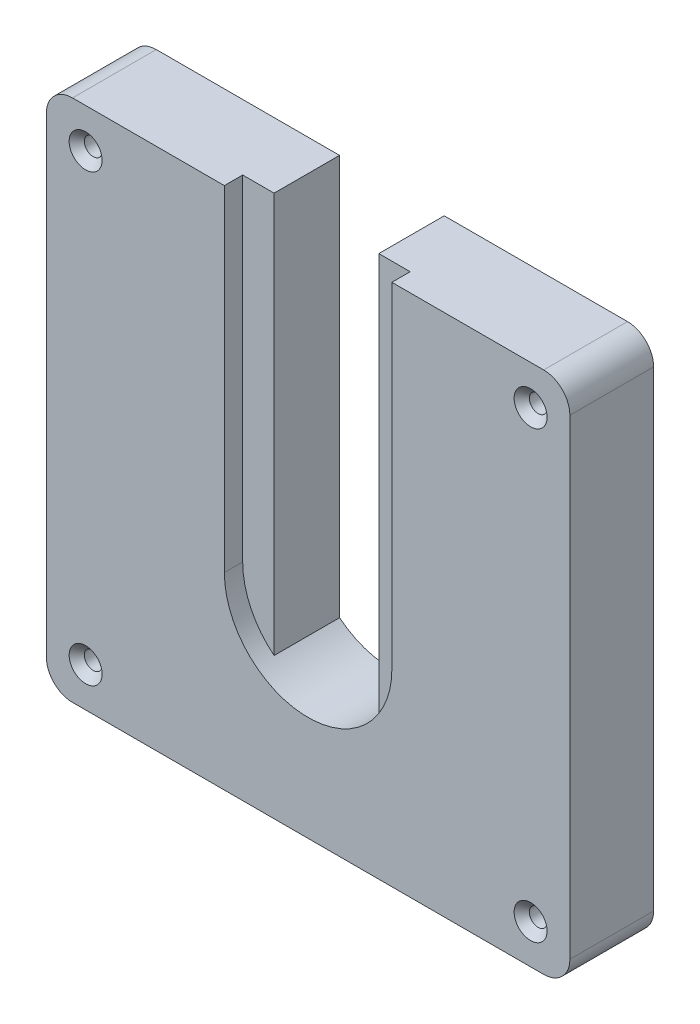
ISO-10303-21;
HEADER;
FILE_DESCRIPTION(('STEP AP214'),'2;1');
FILE_NAME('part.step','',(''),(''),'','','');
FILE_SCHEMA(('AUTOMOTIVE_DESIGN { 1 0 10303 214 1 1 1 1 }'));
ENDSEC;
DATA;
#1=APPLICATION_CONTEXT('core data for automotive mechanical design processes');
#2=APPLICATION_PROTOCOL_DEFINITION('international standard','automotive_design',2000,#1);
#3=PRODUCT_CONTEXT('',#1,'mechanical');
#4=PRODUCT('Part','Part','',(#3));
#5=PRODUCT_RELATED_PRODUCT_CATEGORY('part','',(#4));
#6=PRODUCT_DEFINITION_FORMATION('','',#4);
#7=PRODUCT_DEFINITION_CONTEXT('part definition',#1,'design');
#8=PRODUCT_DEFINITION('design','',#6,#7);
#9=PRODUCT_DEFINITION_SHAPE('','',#8);
#10=(LENGTH_UNIT() NAMED_UNIT(*) SI_UNIT(.MILLI.,.METRE.));
#11=(NAMED_UNIT(*) PLANE_ANGLE_UNIT() SI_UNIT($,.RADIAN.));
#12=(NAMED_UNIT(*) SI_UNIT($,.STERADIAN.) SOLID_ANGLE_UNIT());
#13=UNCERTAINTY_MEASURE_WITH_UNIT(LENGTH_MEASURE(1.E-05),#10,'distance_accuracy_value','');
#14=(GEOMETRIC_REPRESENTATION_CONTEXT(3) GLOBAL_UNCERTAINTY_ASSIGNED_CONTEXT((#13)) GLOBAL_UNIT_ASSIGNED_CONTEXT((#10,
#11,#12)) REPRESENTATION_CONTEXT('',''));
#15=CARTESIAN_POINT('',(0.,0.,0.));
#16=DIRECTION('',(0.,0.,1.));
#17=DIRECTION('',(1.,0.,0.));
#18=AXIS2_PLACEMENT_3D('',#15,#16,#17);
#19=CARTESIAN_POINT('',(10.,-30.,28.5));
#20=DIRECTION('',(1.,0.,0.));
#21=DIRECTION('',(0.,0.,-1.));
#22=AXIS2_PLACEMENT_3D('',#19,#20,#21);
#23=PLANE('',#22);
#24=DIRECTION('',(0.,0.,1.));
#25=VECTOR('',#24,1.);
#26=CARTESIAN_POINT('',(10.,-26.4899959967968,16.));
#27=LINE('',#26,#25);
#28=CARTESIAN_POINT('',(10.,-26.4899959967968,28.5));
#29=VERTEX_POINT('',#28);
#30=CARTESIAN_POINT('',(10.,-26.4899959967968,16.));
#31=VERTEX_POINT('',#30);
#32=EDGE_CURVE('E220',#29,#31,#27,.F.);
#33=ORIENTED_EDGE('',*,*,#32,.F.);
#34=DIRECTION('',(0.,1.,0.));
#35=VECTOR('',#34,1.);
#36=CARTESIAN_POINT('',(10.,-30.,28.5));
#37=LINE('',#36,#35);
#38=CARTESIAN_POINT('',(10.,50.,28.5));
#39=VERTEX_POINT('',#38);
#40=EDGE_CURVE('E271',#29,#39,#37,.T.);
#41=ORIENTED_EDGE('',*,*,#40,.T.);
#42=DIRECTION('',(0.,0.,-1.));
#43=VECTOR('',#42,1.);
#44=CARTESIAN_POINT('',(10.,50.,28.5));
#45=LINE('',#44,#43);
#46=CARTESIAN_POINT('',(10.,50.,16.));
#47=VERTEX_POINT('',#46);
#48=EDGE_CURVE('E244',#39,#47,#45,.T.);
#49=ORIENTED_EDGE('',*,*,#48,.T.);
#50=DIRECTION('',(0.,1.,0.));
#51=VECTOR('',#50,1.);
#52=CARTESIAN_POINT('',(10.,-30.,16.));
#53=LINE('',#52,#51);
#54=EDGE_CURVE('E205',#31,#47,#53,.T.);
#55=ORIENTED_EDGE('',*,*,#54,.F.);
#56=EDGE_LOOP('',(#33,#41,#49,#55));
#57=FACE_BOUND('',#56,.T.);
#58=ADVANCED_FACE('F76',(#57),#23,.F.);
#59=CARTESIAN_POINT('',(16.,-30.,28.5));
#60=DIRECTION('',(0.,0.,-1.));
#61=DIRECTION('',(-1.,0.,0.));
#62=AXIS2_PLACEMENT_3D('',#59,#60,#61);
#63=PLANE('',#62);
#64=CARTESIAN_POINT('',(0.,-14.,28.5));
#65=DIRECTION('',(0.,0.,-1.));
#66=DIRECTION('',(-1.,0.,0.));
#67=AXIS2_PLACEMENT_3D('',#64,#65,#66);
#68=CIRCLE('',#67,16.);
#69=CARTESIAN_POINT('',(16.,-14.,28.5));
#70=VERTEX_POINT('',#69);
#71=EDGE_CURVE('E315',#70,#29,#68,.T.);
#72=ORIENTED_EDGE('',*,*,#71,.F.);
#73=DIRECTION('',(0.,1.,0.));
#74=VECTOR('',#73,1.);
#75=CARTESIAN_POINT('',(16.,-30.,28.5));
#76=LINE('',#75,#74);
#77=CARTESIAN_POINT('',(16.,50.,28.5));
#78=VERTEX_POINT('',#77);
#79=EDGE_CURVE('E274',#70,#78,#76,.T.);
#80=ORIENTED_EDGE('',*,*,#79,.T.);
#81=DIRECTION('',(-1.,0.,0.));
#82=VECTOR('',#81,1.);
#83=CARTESIAN_POINT('',(16.,50.,28.5));
#84=LINE('',#83,#82);
#85=EDGE_CURVE('E240',#78,#39,#84,.T.);
#86=ORIENTED_EDGE('',*,*,#85,.T.);
#87=ORIENTED_EDGE('',*,*,#40,.F.);
#88=EDGE_LOOP('',(#72,#80,#86,#87));
#89=FACE_BOUND('',#88,.T.);
#90=ADVANCED_FACE('F390',(#89),#63,.F.);
#91=CARTESIAN_POINT('',(-16.,-30.,32.));
#92=DIRECTION('',(-1.,0.,0.));
#93=DIRECTION('',(0.,0.,1.));
#94=AXIS2_PLACEMENT_3D('',#91,#92,#93);
#95=PLANE('',#94);
#96=DIRECTION('',(0.,0.,1.));
#97=VECTOR('',#96,1.);
#98=CARTESIAN_POINT('',(-16.,-14.,16.));
#99=LINE('',#98,#97);
#100=CARTESIAN_POINT('',(-16.,-14.,28.5));
#101=VERTEX_POINT('',#100);
#102=CARTESIAN_POINT('',(-16.,-14.,32.));
#103=VERTEX_POINT('',#102);
#104=EDGE_CURVE('E222',#101,#103,#99,.T.);
#105=ORIENTED_EDGE('',*,*,#104,.F.);
#106=DIRECTION('',(0.,1.,0.));
#107=VECTOR('',#106,1.);
#108=CARTESIAN_POINT('',(-16.,-30.,28.5));
#109=LINE('',#108,#107);
#110=CARTESIAN_POINT('',(-16.,50.,28.5));
#111=VERTEX_POINT('',#110);
#112=EDGE_CURVE('E264',#101,#111,#109,.T.);
#113=ORIENTED_EDGE('',*,*,#112,.T.);
#114=DIRECTION('',(0.,0.,1.));
#115=VECTOR('',#114,1.);
#116=CARTESIAN_POINT('',(-16.,50.,32.));
#117=LINE('',#116,#115);
#118=CARTESIAN_POINT('',(-16.,50.,32.));
#119=VERTEX_POINT('',#118);
#120=EDGE_CURVE('E255',#111,#119,#117,.T.);
#121=ORIENTED_EDGE('',*,*,#120,.T.);
#122=DIRECTION('',(0.,1.,0.));
#123=VECTOR('',#122,1.);
#124=CARTESIAN_POINT('',(-16.,-30.,32.));
#125=LINE('',#124,#123);
#126=EDGE_CURVE('E260',#103,#119,#125,.T.);
#127=ORIENTED_EDGE('',*,*,#126,.F.);
#128=EDGE_LOOP('',(#105,#113,#121,#127));
#129=FACE_BOUND('',#128,.T.);
#130=ADVANCED_FACE('F401',(#129),#95,.F.);
#131=CARTESIAN_POINT('',(-16.,-30.,28.5));
#132=DIRECTION('',(0.,0.,-1.));
#133=DIRECTION('',(-1.,0.,0.));
#134=AXIS2_PLACEMENT_3D('',#131,#132,#133);
#135=PLANE('',#134);
#136=CARTESIAN_POINT('',(0.,-14.,28.5));
#137=DIRECTION('',(0.,0.,-1.));
#138=DIRECTION('',(-1.,0.,0.));
#139=AXIS2_PLACEMENT_3D('',#136,#137,#138);
#140=CIRCLE('',#139,16.);
#141=CARTESIAN_POINT('',(-10.,-26.4899959967968,28.5));
#142=VERTEX_POINT('',#141);
#143=EDGE_CURVE('E228',#142,#101,#140,.T.);
#144=ORIENTED_EDGE('',*,*,#143,.F.);
#145=DIRECTION('',(0.,1.,0.));
#146=VECTOR('',#145,1.);
#147=CARTESIAN_POINT('',(-10.,-30.,28.5));
#148=LINE('',#147,#146);
#149=CARTESIAN_POINT('',(-10.,50.,28.5));
#150=VERTEX_POINT('',#149);
#151=EDGE_CURVE('E204',#142,#150,#148,.T.);
#152=ORIENTED_EDGE('',*,*,#151,.T.);
#153=DIRECTION('',(-1.,0.,0.));
#154=VECTOR('',#153,1.);
#155=CARTESIAN_POINT('',(-16.,50.,28.5));
#156=LINE('',#155,#154);
#157=EDGE_CURVE('E251',#150,#111,#156,.T.);
#158=ORIENTED_EDGE('',*,*,#157,.T.);
#159=ORIENTED_EDGE('',*,*,#112,.F.);
#160=EDGE_LOOP('',(#144,#152,#158,#159));
#161=FACE_BOUND('',#160,.T.);
#162=ADVANCED_FACE('F403',(#161),#135,.F.);
#163=CARTESIAN_POINT('',(-10.,-30.,28.5));
#164=DIRECTION('',(-1.,0.,0.));
#165=DIRECTION('',(0.,0.,1.));
#166=AXIS2_PLACEMENT_3D('',#163,#164,#165);
#167=PLANE('',#166);
#168=DIRECTION('',(0.,0.,1.));
#169=VECTOR('',#168,1.);
#170=CARTESIAN_POINT('',(-10.,-26.4899959967968,16.));
#171=LINE('',#170,#169);
#172=CARTESIAN_POINT('',(-10.,-26.4899959967968,16.));
#173=VERTEX_POINT('',#172);
#174=EDGE_CURVE('E209',#173,#142,#171,.T.);
#175=ORIENTED_EDGE('',*,*,#174,.F.);
#176=DIRECTION('',(0.,1.,0.));
#177=VECTOR('',#176,1.);
#178=CARTESIAN_POINT('',(-10.,-30.,16.));
#179=LINE('',#178,#177);
#180=CARTESIAN_POINT('',(-10.,50.,16.));
#181=VERTEX_POINT('',#180);
#182=EDGE_CURVE('E190',#173,#181,#179,.T.);
#183=ORIENTED_EDGE('',*,*,#182,.T.);
#184=DIRECTION('',(0.,0.,1.));
#185=VECTOR('',#184,1.);
#186=CARTESIAN_POINT('',(-10.,50.,28.5));
#187=LINE('',#186,#185);
#188=EDGE_CURVE('E248',#181,#150,#187,.T.);
#189=ORIENTED_EDGE('',*,*,#188,.T.);
#190=ORIENTED_EDGE('',*,*,#151,.F.);
#191=EDGE_LOOP('',(#175,#183,#189,#190));
#192=FACE_BOUND('',#191,.T.);
#193=ADVANCED_FACE('F210',(#192),#167,.F.);
#194=CARTESIAN_POINT('',(50.,50.,32.));
#195=DIRECTION('',(0.,-1.,0.));
#196=DIRECTION('',(0.,0.,-1.));
#197=AXIS2_PLACEMENT_3D('',#194,#195,#196);
#198=PLANE('',#197);
#199=DIRECTION('',(-1.,0.,0.));
#200=VECTOR('',#199,1.);
#201=CARTESIAN_POINT('',(50.,50.,16.));
#202=LINE('',#201,#200);
#203=CARTESIAN_POINT('',(-45.,50.,16.));
#204=VERTEX_POINT('',#203);
#205=EDGE_CURVE('E199',#181,#204,#202,.T.);
#206=ORIENTED_EDGE('',*,*,#205,.T.);
#207=DIRECTION('',(0.,0.,-1.));
#208=VECTOR('',#207,1.);
#209=CARTESIAN_POINT('',(-45.,50.,32.));
#210=LINE('',#209,#208);
#211=CARTESIAN_POINT('',(-45.,50.,32.));
#212=VERTEX_POINT('',#211);
#213=EDGE_CURVE('E12',#204,#212,#210,.F.);
#214=ORIENTED_EDGE('',*,*,#213,.T.);
#215=DIRECTION('',(-1.,0.,0.));
#216=VECTOR('',#215,1.);
#217=CARTESIAN_POINT('',(50.,50.,32.));
#218=LINE('',#217,#216);
#219=EDGE_CURVE('E292',#119,#212,#218,.T.);
#220=ORIENTED_EDGE('',*,*,#219,.F.);
#221=ORIENTED_EDGE('',*,*,#120,.F.);
#222=ORIENTED_EDGE('',*,*,#157,.F.);
#223=ORIENTED_EDGE('',*,*,#188,.F.);
#224=EDGE_LOOP('',(#206,#214,#220,#221,#222,#223));
#225=FACE_BOUND('',#224,.T.);
#226=ADVANCED_FACE('F408',(#225),#198,.F.);
#227=CARTESIAN_POINT('',(-50.,50.,32.));
#228=DIRECTION('',(1.,0.,0.));
#229=DIRECTION('',(0.,0.,-1.));
#230=AXIS2_PLACEMENT_3D('',#227,#228,#229);
#231=PLANE('',#230);
#232=DIRECTION('',(0.,-1.,0.));
#233=VECTOR('',#232,1.);
#234=CARTESIAN_POINT('',(-50.,50.,16.));
#235=LINE('',#234,#233);
#236=CARTESIAN_POINT('',(-50.,45.,16.));
#237=VERTEX_POINT('',#236);
#238=CARTESIAN_POINT('',(-50.,-45.,16.));
#239=VERTEX_POINT('',#238);
#240=EDGE_CURVE('E263',#237,#239,#235,.T.);
#241=ORIENTED_EDGE('',*,*,#240,.T.);
#242=DIRECTION('',(0.,0.,-1.));
#243=VECTOR('',#242,1.);
#244=CARTESIAN_POINT('',(-50.,-45.,32.));
#245=LINE('',#244,#243);
#246=CARTESIAN_POINT('',(-50.,-45.,32.));
#247=VERTEX_POINT('',#246);
#248=EDGE_CURVE('E357',#239,#247,#245,.F.);
#249=ORIENTED_EDGE('',*,*,#248,.T.);
#250=DIRECTION('',(0.,-1.,0.));
#251=VECTOR('',#250,1.);
#252=CARTESIAN_POINT('',(-50.,50.,32.));
#253=LINE('',#252,#251);
#254=CARTESIAN_POINT('',(-50.,45.,32.));
#255=VERTEX_POINT('',#254);
#256=EDGE_CURVE('E280',#255,#247,#253,.T.);
#257=ORIENTED_EDGE('',*,*,#256,.F.);
#258=DIRECTION('',(0.,0.,-1.));
#259=VECTOR('',#258,1.);
#260=CARTESIAN_POINT('',(-50.,45.,32.));
#261=LINE('',#260,#259);
#262=EDGE_CURVE('E353',#255,#237,#261,.T.);
#263=ORIENTED_EDGE('',*,*,#262,.T.);
#264=EDGE_LOOP('',(#241,#249,#257,#263));
#265=FACE_BOUND('',#264,.T.);
#266=ADVANCED_FACE('F418',(#265),#231,.F.);
#267=CARTESIAN_POINT('',(-50.,-50.,32.));
#268=DIRECTION('',(0.,1.,0.));
#269=DIRECTION('',(0.,0.,1.));
#270=AXIS2_PLACEMENT_3D('',#267,#268,#269);
#271=PLANE('',#270);
#272=DIRECTION('',(1.,0.,0.));
#273=VECTOR('',#272,1.);
#274=CARTESIAN_POINT('',(-50.,-50.,32.));
#275=LINE('',#274,#273);
#276=CARTESIAN_POINT('',(-45.,-50.,32.));
#277=VERTEX_POINT('',#276);
#278=CARTESIAN_POINT('',(45.,-50.,32.));
#279=VERTEX_POINT('',#278);
#280=EDGE_CURVE('E284',#277,#279,#275,.T.);
#281=ORIENTED_EDGE('',*,*,#280,.F.);
#282=DIRECTION('',(0.,0.,-1.));
#283=VECTOR('',#282,1.);
#284=CARTESIAN_POINT('',(-45.,-50.,32.));
#285=LINE('',#284,#283);
#286=CARTESIAN_POINT('',(-45.,-50.,16.));
#287=VERTEX_POINT('',#286);
#288=EDGE_CURVE('E337',#277,#287,#285,.T.);
#289=ORIENTED_EDGE('',*,*,#288,.T.);
#290=DIRECTION('',(1.,0.,0.));
#291=VECTOR('',#290,1.);
#292=CARTESIAN_POINT('',(-50.,-50.,16.));
#293=LINE('',#292,#291);
#294=CARTESIAN_POINT('',(45.,-50.,16.));
#295=VERTEX_POINT('',#294);
#296=EDGE_CURVE('E298',#287,#295,#293,.T.);
#297=ORIENTED_EDGE('',*,*,#296,.T.);
#298=DIRECTION('',(0.,0.,-1.));
#299=VECTOR('',#298,1.);
#300=CARTESIAN_POINT('',(45.,-50.,32.));
#301=LINE('',#300,#299);
#302=EDGE_CURVE('E310',#295,#279,#301,.F.);
#303=ORIENTED_EDGE('',*,*,#302,.T.);
#304=EDGE_LOOP('',(#281,#289,#297,#303));
#305=FACE_BOUND('',#304,.T.);
#306=ADVANCED_FACE('F427',(#305),#271,.F.);
#307=CARTESIAN_POINT('',(50.,-50.,32.));
#308=DIRECTION('',(-1.,0.,0.));
#309=DIRECTION('',(0.,0.,1.));
#310=AXIS2_PLACEMENT_3D('',#307,#308,#309);
#311=PLANE('',#310);
#312=DIRECTION('',(0.,1.,0.));
#313=VECTOR('',#312,1.);
#314=CARTESIAN_POINT('',(50.,-50.,32.));
#315=LINE('',#314,#313);
#316=CARTESIAN_POINT('',(50.,-45.,32.));
#317=VERTEX_POINT('',#316);
#318=CARTESIAN_POINT('',(50.,45.,32.));
#319=VERTEX_POINT('',#318);
#320=EDGE_CURVE('E289',#317,#319,#315,.T.);
#321=ORIENTED_EDGE('',*,*,#320,.F.);
#322=DIRECTION('',(0.,0.,-1.));
#323=VECTOR('',#322,1.);
#324=CARTESIAN_POINT('',(50.,-45.,32.));
#325=LINE('',#324,#323);
#326=CARTESIAN_POINT('',(50.,-45.,16.));
#327=VERTEX_POINT('',#326);
#328=EDGE_CURVE('E373',#317,#327,#325,.T.);
#329=ORIENTED_EDGE('',*,*,#328,.T.);
#330=DIRECTION('',(0.,1.,0.));
#331=VECTOR('',#330,1.);
#332=CARTESIAN_POINT('',(50.,-50.,16.));
#333=LINE('',#332,#331);
#334=CARTESIAN_POINT('',(50.,45.,16.));
#335=VERTEX_POINT('',#334);
#336=EDGE_CURVE('E302',#327,#335,#333,.T.);
#337=ORIENTED_EDGE('',*,*,#336,.T.);
#338=DIRECTION('',(0.,0.,-1.));
#339=VECTOR('',#338,1.);
#340=CARTESIAN_POINT('',(50.,45.,32.));
#341=LINE('',#340,#339);
#342=EDGE_CURVE('E100',#335,#319,#341,.F.);
#343=ORIENTED_EDGE('',*,*,#342,.T.);
#344=EDGE_LOOP('',(#321,#329,#337,#343));
#345=FACE_BOUND('',#344,.T.);
#346=ADVANCED_FACE('F432',(#345),#311,.F.);
#347=CARTESIAN_POINT('',(45.,50.,32.));
#348=VERTEX_POINT('',#347);
#349=CARTESIAN_POINT('',(16.,50.,32.));
#350=VERTEX_POINT('',#349);
#351=EDGE_CURVE('E215',#348,#350,#218,.T.);
#352=ORIENTED_EDGE('',*,*,#351,.F.);
#353=DIRECTION('',(0.,0.,-1.));
#354=VECTOR('',#353,1.);
#355=CARTESIAN_POINT('',(45.,50.,32.));
#356=LINE('',#355,#354);
#357=CARTESIAN_POINT('',(45.,50.,16.));
#358=VERTEX_POINT('',#357);
#359=EDGE_CURVE('E85',#348,#358,#356,.T.);
#360=ORIENTED_EDGE('',*,*,#359,.T.);
#361=EDGE_CURVE('E285',#358,#47,#202,.T.);
#362=ORIENTED_EDGE('',*,*,#361,.T.);
#363=ORIENTED_EDGE('',*,*,#48,.F.);
#364=ORIENTED_EDGE('',*,*,#85,.F.);
#365=DIRECTION('',(0.,0.,-1.));
#366=VECTOR('',#365,1.);
#367=CARTESIAN_POINT('',(16.,50.,32.));
#368=LINE('',#367,#366);
#369=EDGE_CURVE('E236',#350,#78,#368,.T.);
#370=ORIENTED_EDGE('',*,*,#369,.F.);
#371=EDGE_LOOP('',(#352,#360,#362,#363,#364,#370));
#372=FACE_BOUND('',#371,.T.);
#373=ADVANCED_FACE('F381',(#372),#198,.F.);
#374=CARTESIAN_POINT('',(0.,0.,32.));
#375=DIRECTION('',(0.,0.,1.));
#376=DIRECTION('',(1.,0.,0.));
#377=AXIS2_PLACEMENT_3D('',#374,#375,#376);
#378=PLANE('',#377);
#379=CARTESIAN_POINT('',(-42.5,42.5,32.));
#380=DIRECTION('',(0.,0.,1.));
#381=DIRECTION('',(1.,0.,0.));
#382=AXIS2_PLACEMENT_3D('',#379,#380,#381);
#383=CIRCLE('',#382,3.15);
#384=CARTESIAN_POINT('',(-39.35,42.5,32.));
#385=VERTEX_POINT('',#384);
#386=EDGE_CURVE('E702',#385,#385,#383,.T.);
#387=ORIENTED_EDGE('',*,*,#386,.F.);
#388=EDGE_LOOP('',(#387));
#389=FACE_BOUND('',#388,.T.);
#390=CARTESIAN_POINT('',(42.5,42.5,32.));
#391=DIRECTION('',(0.,0.,1.));
#392=DIRECTION('',(1.,0.,0.));
#393=AXIS2_PLACEMENT_3D('',#390,#391,#392);
#394=CIRCLE('',#393,3.15);
#395=CARTESIAN_POINT('',(45.65,42.5,32.));
#396=VERTEX_POINT('',#395);
#397=EDGE_CURVE('E333',#396,#396,#394,.T.);
#398=ORIENTED_EDGE('',*,*,#397,.F.);
#399=EDGE_LOOP('',(#398));
#400=FACE_BOUND('',#399,.T.);
#401=CARTESIAN_POINT('',(42.5,-42.5,32.));
#402=DIRECTION('',(0.,0.,1.));
#403=DIRECTION('',(1.,0.,0.));
#404=AXIS2_PLACEMENT_3D('',#401,#402,#403);
#405=CIRCLE('',#404,3.15);
#406=CARTESIAN_POINT('',(45.65,-42.5,32.));
#407=VERTEX_POINT('',#406);
#408=EDGE_CURVE('E327',#407,#407,#405,.T.);
#409=ORIENTED_EDGE('',*,*,#408,.F.);
#410=EDGE_LOOP('',(#409));
#411=FACE_BOUND('',#410,.T.);
#412=CARTESIAN_POINT('',(-42.5,-42.5,32.));
#413=DIRECTION('',(0.,0.,1.));
#414=DIRECTION('',(1.,0.,0.));
#415=AXIS2_PLACEMENT_3D('',#412,#413,#414);
#416=CIRCLE('',#415,3.15);
#417=CARTESIAN_POINT('',(-39.35,-42.5,32.));
#418=VERTEX_POINT('',#417);
#419=EDGE_CURVE('E321',#418,#418,#416,.T.);
#420=ORIENTED_EDGE('',*,*,#419,.F.);
#421=EDGE_LOOP('',(#420));
#422=FACE_BOUND('',#421,.T.);
#423=ORIENTED_EDGE('',*,*,#256,.T.);
#424=CARTESIAN_POINT('',(-45.,-45.,32.));
#425=DIRECTION('',(0.,0.,1.));
#426=DIRECTION('',(1.,0.,0.));
#427=AXIS2_PLACEMENT_3D('',#424,#425,#426);
#428=CIRCLE('',#427,5.);
#429=EDGE_CURVE('E368',#247,#277,#428,.T.);
#430=ORIENTED_EDGE('',*,*,#429,.T.);
#431=ORIENTED_EDGE('',*,*,#280,.T.);
#432=CARTESIAN_POINT('',(45.,-45.,32.));
#433=DIRECTION('',(0.,0.,1.));
#434=DIRECTION('',(1.,0.,0.));
#435=AXIS2_PLACEMENT_3D('',#432,#433,#434);
#436=CIRCLE('',#435,5.);
#437=EDGE_CURVE('E365',#279,#317,#436,.T.);
#438=ORIENTED_EDGE('',*,*,#437,.T.);
#439=ORIENTED_EDGE('',*,*,#320,.T.);
#440=CARTESIAN_POINT('',(45.,45.,32.));
#441=DIRECTION('',(0.,0.,1.));
#442=DIRECTION('',(1.,0.,0.));
#443=AXIS2_PLACEMENT_3D('',#440,#441,#442);
#444=CIRCLE('',#443,5.);
#445=EDGE_CURVE('E92',#319,#348,#444,.T.);
#446=ORIENTED_EDGE('',*,*,#445,.T.);
#447=ORIENTED_EDGE('',*,*,#351,.T.);
#448=DIRECTION('',(0.,1.,0.));
#449=VECTOR('',#448,1.);
#450=CARTESIAN_POINT('',(16.,-30.,32.));
#451=LINE('',#450,#449);
#452=CARTESIAN_POINT('',(16.,-14.,32.));
#453=VERTEX_POINT('',#452);
#454=EDGE_CURVE('E259',#453,#350,#451,.T.);
#455=ORIENTED_EDGE('',*,*,#454,.F.);
#456=CARTESIAN_POINT('',(0.,-14.,32.));
#457=DIRECTION('',(0.,0.,1.));
#458=DIRECTION('',(1.,0.,0.));
#459=AXIS2_PLACEMENT_3D('',#456,#457,#458);
#460=CIRCLE('',#459,16.);
#461=EDGE_CURVE('E223',#103,#453,#460,.T.);
#462=ORIENTED_EDGE('',*,*,#461,.F.);
#463=ORIENTED_EDGE('',*,*,#126,.T.);
#464=ORIENTED_EDGE('',*,*,#219,.T.);
#465=CARTESIAN_POINT('',(-45.,45.,32.));
#466=DIRECTION('',(0.,0.,1.));
#467=DIRECTION('',(1.,0.,0.));
#468=AXIS2_PLACEMENT_3D('',#465,#466,#467);
#469=CIRCLE('',#468,5.);
#470=EDGE_CURVE('E360',#212,#255,#469,.T.);
#471=ORIENTED_EDGE('',*,*,#470,.T.);
#472=EDGE_LOOP('',(#423,#430,#431,#438,#439,#446,#447,#455,#462,#463,#464,#471));
#473=FACE_BOUND('',#472,.T.);
#474=ADVANCED_FACE('F397',(#389,#400,#411,#422,#473),#378,.T.);
#475=CARTESIAN_POINT('',(0.,0.,16.));
#476=DIRECTION('',(0.,0.,1.));
#477=DIRECTION('',(1.,0.,0.));
#478=AXIS2_PLACEMENT_3D('',#475,#476,#477);
#479=PLANE('',#478);
#480=CARTESIAN_POINT('',(-42.5,42.5,16.));
#481=DIRECTION('',(0.,0.,1.));
#482=DIRECTION('',(1.,0.,0.));
#483=AXIS2_PLACEMENT_3D('',#480,#481,#482);
#484=CIRCLE('',#483,1.69999999999999);
#485=CARTESIAN_POINT('',(-40.8,42.5,16.));
#486=VERTEX_POINT('',#485);
#487=EDGE_CURVE('E329',#486,#486,#484,.T.);
#488=ORIENTED_EDGE('',*,*,#487,.T.);
#489=EDGE_LOOP('',(#488));
#490=FACE_BOUND('',#489,.T.);
#491=CARTESIAN_POINT('',(42.5,42.5,16.));
#492=DIRECTION('',(0.,0.,1.));
#493=DIRECTION('',(1.,0.,0.));
#494=AXIS2_PLACEMENT_3D('',#491,#492,#493);
#495=CIRCLE('',#494,1.69999999999999);
#496=CARTESIAN_POINT('',(44.2,42.5,16.));
#497=VERTEX_POINT('',#496);
#498=EDGE_CURVE('E323',#497,#497,#495,.T.);
#499=ORIENTED_EDGE('',*,*,#498,.T.);
#500=EDGE_LOOP('',(#499));
#501=FACE_BOUND('',#500,.T.);
#502=CARTESIAN_POINT('',(42.5,-42.5,16.));
#503=DIRECTION('',(0.,0.,1.));
#504=DIRECTION('',(1.,0.,0.));
#505=AXIS2_PLACEMENT_3D('',#502,#503,#504);
#506=CIRCLE('',#505,1.69999999999999);
#507=CARTESIAN_POINT('',(44.2,-42.5,16.));
#508=VERTEX_POINT('',#507);
#509=EDGE_CURVE('E317',#508,#508,#506,.T.);
#510=ORIENTED_EDGE('',*,*,#509,.T.);
#511=EDGE_LOOP('',(#510));
#512=FACE_BOUND('',#511,.T.);
#513=CARTESIAN_POINT('',(-42.5,-42.5,16.));
#514=DIRECTION('',(0.,0.,1.));
#515=DIRECTION('',(1.,0.,0.));
#516=AXIS2_PLACEMENT_3D('',#513,#514,#515);
#517=CIRCLE('',#516,1.69999999999999);
#518=CARTESIAN_POINT('',(-40.8,-42.5,16.));
#519=VERTEX_POINT('',#518);
#520=EDGE_CURVE('E311',#519,#519,#517,.T.);
#521=ORIENTED_EDGE('',*,*,#520,.T.);
#522=EDGE_LOOP('',(#521));
#523=FACE_BOUND('',#522,.T.);
#524=ORIENTED_EDGE('',*,*,#296,.F.);
#525=CARTESIAN_POINT('',(-45.,-45.,16.));
#526=DIRECTION('',(0.,0.,1.));
#527=DIRECTION('',(1.,0.,0.));
#528=AXIS2_PLACEMENT_3D('',#525,#526,#527);
#529=CIRCLE('',#528,5.);
#530=EDGE_CURVE('E350',#287,#239,#529,.F.);
#531=ORIENTED_EDGE('',*,*,#530,.T.);
#532=ORIENTED_EDGE('',*,*,#240,.F.);
#533=CARTESIAN_POINT('',(-45.,45.,16.));
#534=DIRECTION('',(0.,0.,1.));
#535=DIRECTION('',(1.,0.,0.));
#536=AXIS2_PLACEMENT_3D('',#533,#534,#535);
#537=CIRCLE('',#536,5.);
#538=EDGE_CURVE('E341',#237,#204,#537,.F.);
#539=ORIENTED_EDGE('',*,*,#538,.T.);
#540=ORIENTED_EDGE('',*,*,#205,.F.);
#541=ORIENTED_EDGE('',*,*,#182,.F.);
#542=CARTESIAN_POINT('',(0.,-14.,16.));
#543=DIRECTION('',(0.,0.,1.));
#544=DIRECTION('',(1.,0.,0.));
#545=AXIS2_PLACEMENT_3D('',#542,#543,#544);
#546=CIRCLE('',#545,16.);
#547=EDGE_CURVE('E196',#173,#31,#546,.T.);
#548=ORIENTED_EDGE('',*,*,#547,.T.);
#549=ORIENTED_EDGE('',*,*,#54,.T.);
#550=ORIENTED_EDGE('',*,*,#361,.F.);
#551=CARTESIAN_POINT('',(45.,45.,16.));
#552=DIRECTION('',(0.,0.,1.));
#553=DIRECTION('',(1.,0.,0.));
#554=AXIS2_PLACEMENT_3D('',#551,#552,#553);
#555=CIRCLE('',#554,5.);
#556=EDGE_CURVE('E344',#358,#335,#555,.F.);
#557=ORIENTED_EDGE('',*,*,#556,.T.);
#558=ORIENTED_EDGE('',*,*,#336,.F.);
#559=CARTESIAN_POINT('',(45.,-45.,16.));
#560=DIRECTION('',(0.,0.,1.));
#561=DIRECTION('',(1.,0.,0.));
#562=AXIS2_PLACEMENT_3D('',#559,#560,#561);
#563=CIRCLE('',#562,5.);
#564=EDGE_CURVE('E347',#327,#295,#563,.F.);
#565=ORIENTED_EDGE('',*,*,#564,.T.);
#566=EDGE_LOOP('',(#524,#531,#532,#539,#540,#541,#548,#549,#550,#557,#558,#565));
#567=FACE_BOUND('',#566,.T.);
#568=ADVANCED_FACE('F193',(#490,#501,#512,#523,#567),#479,.F.);
#569=CARTESIAN_POINT('',(16.,-30.,32.));
#570=DIRECTION('',(1.,0.,0.));
#571=DIRECTION('',(0.,0.,-1.));
#572=AXIS2_PLACEMENT_3D('',#569,#570,#571);
#573=PLANE('',#572);
#574=ORIENTED_EDGE('',*,*,#79,.F.);
#575=DIRECTION('',(0.,0.,1.));
#576=VECTOR('',#575,1.);
#577=CARTESIAN_POINT('',(16.,-14.,16.));
#578=LINE('',#577,#576);
#579=EDGE_CURVE('E214',#70,#453,#578,.T.);
#580=ORIENTED_EDGE('',*,*,#579,.T.);
#581=ORIENTED_EDGE('',*,*,#454,.T.);
#582=ORIENTED_EDGE('',*,*,#369,.T.);
#583=EDGE_LOOP('',(#574,#580,#581,#582));
#584=FACE_BOUND('',#583,.T.);
#585=ADVANCED_FACE('F394',(#584),#573,.F.);
#586=CARTESIAN_POINT('',(0.,-14.,16.));
#587=DIRECTION('',(0.,0.,1.));
#588=DIRECTION('',(1.,0.,0.));
#589=AXIS2_PLACEMENT_3D('',#586,#587,#588);
#590=CYLINDRICAL_SURFACE('',#589,16.);
#591=ORIENTED_EDGE('',*,*,#174,.T.);
#592=ORIENTED_EDGE('',*,*,#143,.T.);
#593=ORIENTED_EDGE('',*,*,#104,.T.);
#594=ORIENTED_EDGE('',*,*,#461,.T.);
#595=ORIENTED_EDGE('',*,*,#579,.F.);
#596=ORIENTED_EDGE('',*,*,#71,.T.);
#597=ORIENTED_EDGE('',*,*,#32,.T.);
#598=ORIENTED_EDGE('',*,*,#547,.F.);
#599=EDGE_LOOP('',(#591,#592,#593,#594,#595,#596,#597,#598));
#600=FACE_BOUND('',#599,.T.);
#601=ADVANCED_FACE('F218',(#600),#590,.F.);
#602=CARTESIAN_POINT('',(-42.5,-42.5,32.));
#603=DIRECTION('',(0.,0.,1.));
#604=DIRECTION('',(1.,0.,0.));
#605=AXIS2_PLACEMENT_3D('',#602,#603,#604);
#606=CYLINDRICAL_SURFACE('',#605,1.69999999999999);
#607=CARTESIAN_POINT('',(-42.5,-42.5,30.55));
#608=DIRECTION('',(0.,0.,1.));
#609=DIRECTION('',(1.,0.,0.));
#610=AXIS2_PLACEMENT_3D('',#607,#608,#609);
#611=CIRCLE('',#610,1.69999999999999);
#612=CARTESIAN_POINT('',(-40.8,-42.5,30.55));
#613=VERTEX_POINT('',#612);
#614=EDGE_CURVE('E316',#613,#613,#611,.T.);
#615=ORIENTED_EDGE('',*,*,#614,.T.);
#616=EDGE_LOOP('',(#615));
#617=FACE_BOUND('',#616,.T.);
#618=ORIENTED_EDGE('',*,*,#520,.F.);
#619=EDGE_LOOP('',(#618));
#620=FACE_BOUND('',#619,.T.);
#621=ADVANCED_FACE('F500',(#617,#620),#606,.F.);
#622=CARTESIAN_POINT('',(-42.5,-42.5,32.));
#623=DIRECTION('',(0.,0.,1.));
#624=DIRECTION('',(1.,0.,0.));
#625=AXIS2_PLACEMENT_3D('',#622,#623,#624);
#626=CONICAL_SURFACE('',#625,3.15,0.78539816339745);
#627=ORIENTED_EDGE('',*,*,#614,.F.);
#628=EDGE_LOOP('',(#627));
#629=FACE_BOUND('',#628,.T.);
#630=ORIENTED_EDGE('',*,*,#419,.T.);
#631=EDGE_LOOP('',(#630));
#632=FACE_BOUND('',#631,.T.);
#633=ADVANCED_FACE('F496',(#629,#632),#626,.F.);
#634=CARTESIAN_POINT('',(42.5,-42.5,32.));
#635=DIRECTION('',(0.,0.,1.));
#636=DIRECTION('',(1.,0.,0.));
#637=AXIS2_PLACEMENT_3D('',#634,#635,#636);
#638=CYLINDRICAL_SURFACE('',#637,1.69999999999999);
#639=CARTESIAN_POINT('',(42.5,-42.5,30.55));
#640=DIRECTION('',(0.,0.,1.));
#641=DIRECTION('',(1.,0.,0.));
#642=AXIS2_PLACEMENT_3D('',#639,#640,#641);
#643=CIRCLE('',#642,1.69999999999999);
#644=CARTESIAN_POINT('',(44.2,-42.5,30.55));
#645=VERTEX_POINT('',#644);
#646=EDGE_CURVE('E322',#645,#645,#643,.T.);
#647=ORIENTED_EDGE('',*,*,#646,.T.);
#648=EDGE_LOOP('',(#647));
#649=FACE_BOUND('',#648,.T.);
#650=ORIENTED_EDGE('',*,*,#509,.F.);
#651=EDGE_LOOP('',(#650));
#652=FACE_BOUND('',#651,.T.);
#653=ADVANCED_FACE('F492',(#649,#652),#638,.F.);
#654=CARTESIAN_POINT('',(42.5,-42.5,32.));
#655=DIRECTION('',(0.,0.,1.));
#656=DIRECTION('',(1.,0.,0.));
#657=AXIS2_PLACEMENT_3D('',#654,#655,#656);
#658=CONICAL_SURFACE('',#657,3.15,0.78539816339745);
#659=ORIENTED_EDGE('',*,*,#646,.F.);
#660=EDGE_LOOP('',(#659));
#661=FACE_BOUND('',#660,.T.);
#662=ORIENTED_EDGE('',*,*,#408,.T.);
#663=EDGE_LOOP('',(#662));
#664=FACE_BOUND('',#663,.T.);
#665=ADVANCED_FACE('F488',(#661,#664),#658,.F.);
#666=CARTESIAN_POINT('',(42.5,42.5,32.));
#667=DIRECTION('',(0.,0.,1.));
#668=DIRECTION('',(1.,0.,0.));
#669=AXIS2_PLACEMENT_3D('',#666,#667,#668);
#670=CYLINDRICAL_SURFACE('',#669,1.69999999999999);
#671=CARTESIAN_POINT('',(42.5,42.5,30.55));
#672=DIRECTION('',(0.,0.,1.));
#673=DIRECTION('',(1.,0.,0.));
#674=AXIS2_PLACEMENT_3D('',#671,#672,#673);
#675=CIRCLE('',#674,1.69999999999999);
#676=CARTESIAN_POINT('',(44.2,42.5,30.55));
#677=VERTEX_POINT('',#676);
#678=EDGE_CURVE('E328',#677,#677,#675,.T.);
#679=ORIENTED_EDGE('',*,*,#678,.T.);
#680=EDGE_LOOP('',(#679));
#681=FACE_BOUND('',#680,.T.);
#682=ORIENTED_EDGE('',*,*,#498,.F.);
#683=EDGE_LOOP('',(#682));
#684=FACE_BOUND('',#683,.T.);
#685=ADVANCED_FACE('F484',(#681,#684),#670,.F.);
#686=CARTESIAN_POINT('',(42.5,42.5,32.));
#687=DIRECTION('',(0.,0.,1.));
#688=DIRECTION('',(1.,0.,0.));
#689=AXIS2_PLACEMENT_3D('',#686,#687,#688);
#690=CONICAL_SURFACE('',#689,3.15,0.78539816339745);
#691=ORIENTED_EDGE('',*,*,#678,.F.);
#692=EDGE_LOOP('',(#691));
#693=FACE_BOUND('',#692,.T.);
#694=ORIENTED_EDGE('',*,*,#397,.T.);
#695=EDGE_LOOP('',(#694));
#696=FACE_BOUND('',#695,.T.);
#697=ADVANCED_FACE('F476',(#693,#696),#690,.F.);
#698=CARTESIAN_POINT('',(-42.5,42.5,32.));
#699=DIRECTION('',(0.,0.,1.));
#700=DIRECTION('',(1.,0.,0.));
#701=AXIS2_PLACEMENT_3D('',#698,#699,#700);
#702=CYLINDRICAL_SURFACE('',#701,1.69999999999999);
#703=CARTESIAN_POINT('',(-42.5,42.5,30.55));
#704=DIRECTION('',(0.,0.,1.));
#705=DIRECTION('',(1.,0.,0.));
#706=AXIS2_PLACEMENT_3D('',#703,#704,#705);
#707=CIRCLE('',#706,1.69999999999999);
#708=CARTESIAN_POINT('',(-40.8,42.5,30.55));
#709=VERTEX_POINT('',#708);
#710=EDGE_CURVE('E334',#709,#709,#707,.T.);
#711=ORIENTED_EDGE('',*,*,#710,.T.);
#712=EDGE_LOOP('',(#711));
#713=FACE_BOUND('',#712,.T.);
#714=ORIENTED_EDGE('',*,*,#487,.F.);
#715=EDGE_LOOP('',(#714));
#716=FACE_BOUND('',#715,.T.);
#717=ADVANCED_FACE('F470',(#713,#716),#702,.F.);
#718=CARTESIAN_POINT('',(-42.5,42.5,32.));
#719=DIRECTION('',(0.,0.,1.));
#720=DIRECTION('',(1.,0.,0.));
#721=AXIS2_PLACEMENT_3D('',#718,#719,#720);
#722=CONICAL_SURFACE('',#721,3.15,0.78539816339745);
#723=ORIENTED_EDGE('',*,*,#710,.F.);
#724=EDGE_LOOP('',(#723));
#725=FACE_BOUND('',#724,.T.);
#726=ORIENTED_EDGE('',*,*,#386,.T.);
#727=EDGE_LOOP('',(#726));
#728=FACE_BOUND('',#727,.T.);
#729=ADVANCED_FACE('F466',(#725,#728),#722,.F.);
#730=CARTESIAN_POINT('',(-45.,-45.,32.));
#731=DIRECTION('',(0.,0.,-1.));
#732=DIRECTION('',(-1.,0.,0.));
#733=AXIS2_PLACEMENT_3D('',#730,#731,#732);
#734=CYLINDRICAL_SURFACE('',#733,5.);
#735=ORIENTED_EDGE('',*,*,#429,.F.);
#736=ORIENTED_EDGE('',*,*,#248,.F.);
#737=ORIENTED_EDGE('',*,*,#530,.F.);
#738=ORIENTED_EDGE('',*,*,#288,.F.);
#739=EDGE_LOOP('',(#735,#736,#737,#738));
#740=FACE_BOUND('',#739,.T.);
#741=ADVANCED_FACE('F422',(#740),#734,.T.);
#742=CARTESIAN_POINT('',(45.,-45.,32.));
#743=DIRECTION('',(0.,0.,-1.));
#744=DIRECTION('',(-1.,0.,0.));
#745=AXIS2_PLACEMENT_3D('',#742,#743,#744);
#746=CYLINDRICAL_SURFACE('',#745,5.);
#747=ORIENTED_EDGE('',*,*,#437,.F.);
#748=ORIENTED_EDGE('',*,*,#302,.F.);
#749=ORIENTED_EDGE('',*,*,#564,.F.);
#750=ORIENTED_EDGE('',*,*,#328,.F.);
#751=EDGE_LOOP('',(#747,#748,#749,#750));
#752=FACE_BOUND('',#751,.T.);
#753=ADVANCED_FACE('F430',(#752),#746,.T.);
#754=CARTESIAN_POINT('',(45.,45.,32.));
#755=DIRECTION('',(0.,0.,-1.));
#756=DIRECTION('',(-1.,0.,0.));
#757=AXIS2_PLACEMENT_3D('',#754,#755,#756);
#758=CYLINDRICAL_SURFACE('',#757,5.);
#759=ORIENTED_EDGE('',*,*,#445,.F.);
#760=ORIENTED_EDGE('',*,*,#342,.F.);
#761=ORIENTED_EDGE('',*,*,#556,.F.);
#762=ORIENTED_EDGE('',*,*,#359,.F.);
#763=EDGE_LOOP('',(#759,#760,#761,#762));
#764=FACE_BOUND('',#763,.T.);
#765=ADVANCED_FACE('F433',(#764),#758,.T.);
#766=CARTESIAN_POINT('',(-45.,45.,32.));
#767=DIRECTION('',(0.,0.,-1.));
#768=DIRECTION('',(-1.,0.,0.));
#769=AXIS2_PLACEMENT_3D('',#766,#767,#768);
#770=CYLINDRICAL_SURFACE('',#769,5.);
#771=ORIENTED_EDGE('',*,*,#470,.F.);
#772=ORIENTED_EDGE('',*,*,#213,.F.);
#773=ORIENTED_EDGE('',*,*,#538,.F.);
#774=ORIENTED_EDGE('',*,*,#262,.F.);
#775=EDGE_LOOP('',(#771,#772,#773,#774));
#776=FACE_BOUND('',#775,.T.);
#777=ADVANCED_FACE('F78',(#776),#770,.T.);
#778=CLOSED_SHELL('',(#58,#90,#130,#162,#193,#226,#266,#306,#346,#373,#474,#568,#585,#601,#621,
#633,#653,#665,#685,#697,#717,#729,#741,#753,#765,#777));
#779=MANIFOLD_SOLID_BREP('B2',#778);
#780=ADVANCED_BREP_SHAPE_REPRESENTATION('',(#18,#779),#14);
#781=SHAPE_DEFINITION_REPRESENTATION(#9,#780);
ENDSEC;
END-ISO-10303-21;
